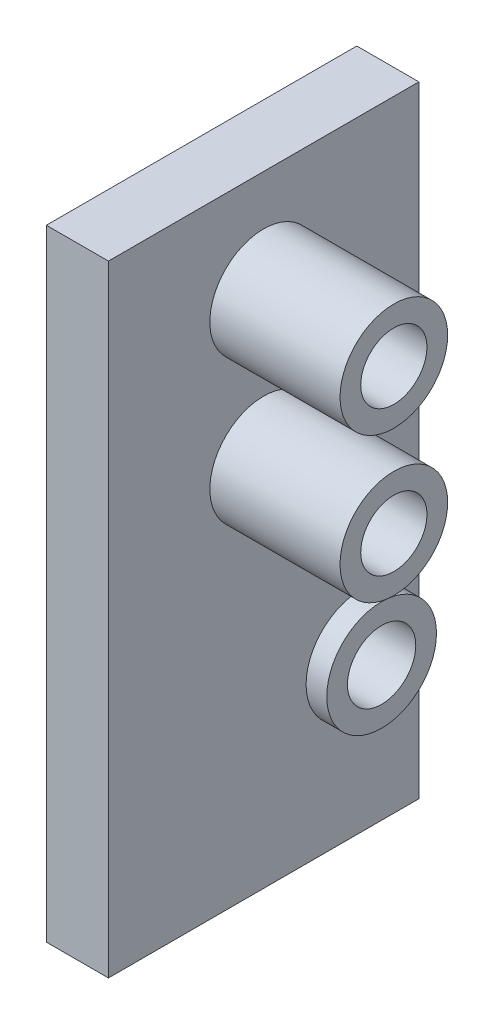
ISO-10303-21;
HEADER;
FILE_DESCRIPTION(('STEP AP214'),'2;1');
FILE_NAME('part.step','',(''),(''),'','','');
FILE_SCHEMA(('AUTOMOTIVE_DESIGN { 1 0 10303 214 1 1 1 1 }'));
ENDSEC;
DATA;
#1=APPLICATION_CONTEXT('core data for automotive mechanical design processes');
#2=APPLICATION_PROTOCOL_DEFINITION('international standard','automotive_design',2000,#1);
#3=PRODUCT_CONTEXT('',#1,'mechanical');
#4=PRODUCT('Part','Part','',(#3));
#5=PRODUCT_RELATED_PRODUCT_CATEGORY('part','',(#4));
#6=PRODUCT_DEFINITION_FORMATION('','',#4);
#7=PRODUCT_DEFINITION_CONTEXT('part definition',#1,'design');
#8=PRODUCT_DEFINITION('design','',#6,#7);
#9=PRODUCT_DEFINITION_SHAPE('','',#8);
#10=(LENGTH_UNIT() NAMED_UNIT(*) SI_UNIT(.MILLI.,.METRE.));
#11=(NAMED_UNIT(*) PLANE_ANGLE_UNIT() SI_UNIT($,.RADIAN.));
#12=(NAMED_UNIT(*) SI_UNIT($,.STERADIAN.) SOLID_ANGLE_UNIT());
#13=UNCERTAINTY_MEASURE_WITH_UNIT(LENGTH_MEASURE(1.E-05),#10,'distance_accuracy_value','');
#14=(GEOMETRIC_REPRESENTATION_CONTEXT(3) GLOBAL_UNCERTAINTY_ASSIGNED_CONTEXT((#13)) GLOBAL_UNIT_ASSIGNED_CONTEXT((#10,
#11,#12)) REPRESENTATION_CONTEXT('',''));
#15=CARTESIAN_POINT('',(0.,0.,0.));
#16=DIRECTION('',(0.,0.,1.));
#17=DIRECTION('',(1.,0.,0.));
#18=AXIS2_PLACEMENT_3D('',#15,#16,#17);
#19=CARTESIAN_POINT('',(-5.,0.,0.));
#20=DIRECTION('',(-1.,0.,0.));
#21=DIRECTION('',(0.,0.,1.));
#22=AXIS2_PLACEMENT_3D('',#19,#20,#21);
#23=PLANE('',#22);
#24=CARTESIAN_POINT('',(-5.,18.,7.5));
#25=DIRECTION('',(1.,0.,0.));
#26=DIRECTION('',(0.,0.,-1.));
#27=AXIS2_PLACEMENT_3D('',#24,#25,#26);
#28=CIRCLE('',#27,2.6);
#29=CARTESIAN_POINT('',(-5.,18.,4.9));
#30=VERTEX_POINT('',#29);
#31=EDGE_CURVE('E45',#30,#30,#28,.F.);
#32=ORIENTED_EDGE('',*,*,#31,.T.);
#33=EDGE_LOOP('',(#32));
#34=FACE_BOUND('',#33,.T.);
#35=DIRECTION('',(0.,0.,1.));
#36=VECTOR('',#35,1.);
#37=CARTESIAN_POINT('',(-5.,30.,0.));
#38=LINE('',#37,#36);
#39=CARTESIAN_POINT('',(-5.,30.,0.));
#40=VERTEX_POINT('',#39);
#41=CARTESIAN_POINT('',(-5.,30.,15.));
#42=VERTEX_POINT('',#41);
#43=EDGE_CURVE('E94',#40,#42,#38,.T.);
#44=ORIENTED_EDGE('',*,*,#43,.T.);
#45=DIRECTION('',(0.,1.,0.));
#46=VECTOR('',#45,1.);
#47=CARTESIAN_POINT('',(-5.,0.,15.));
#48=LINE('',#47,#46);
#49=CARTESIAN_POINT('',(-5.,0.,15.));
#50=VERTEX_POINT('',#49);
#51=EDGE_CURVE('E108',#50,#42,#48,.T.);
#52=ORIENTED_EDGE('',*,*,#51,.F.);
#53=DIRECTION('',(0.,0.,1.));
#54=VECTOR('',#53,1.);
#55=CARTESIAN_POINT('',(-5.,0.,0.));
#56=LINE('',#55,#54);
#57=CARTESIAN_POINT('',(-5.,0.,0.));
#58=VERTEX_POINT('',#57);
#59=EDGE_CURVE('E96',#58,#50,#56,.T.);
#60=ORIENTED_EDGE('',*,*,#59,.F.);
#61=DIRECTION('',(0.,1.,0.));
#62=VECTOR('',#61,1.);
#63=CARTESIAN_POINT('',(-5.,0.,0.));
#64=LINE('',#63,#62);
#65=EDGE_CURVE('E82',#58,#40,#64,.T.);
#66=ORIENTED_EDGE('',*,*,#65,.T.);
#67=EDGE_LOOP('',(#44,#52,#60,#66));
#68=FACE_BOUND('',#67,.T.);
#69=CARTESIAN_POINT('',(-5.,7.5,2.8));
#70=DIRECTION('',(-1.,0.,0.));
#71=DIRECTION('',(0.,0.,1.));
#72=AXIS2_PLACEMENT_3D('',#69,#70,#71);
#73=CIRCLE('',#72,2.65);
#74=CARTESIAN_POINT('',(-5.,7.5,5.45));
#75=VERTEX_POINT('',#74);
#76=EDGE_CURVE('E87',#75,#75,#73,.F.);
#77=ORIENTED_EDGE('',*,*,#76,.F.);
#78=EDGE_LOOP('',(#77));
#79=FACE_BOUND('',#78,.T.);
#80=CARTESIAN_POINT('',(-5.,25.,7.5));
#81=DIRECTION('',(1.,0.,0.));
#82=DIRECTION('',(0.,0.,-1.));
#83=AXIS2_PLACEMENT_3D('',#80,#81,#82);
#84=CIRCLE('',#83,2.6);
#85=CARTESIAN_POINT('',(-5.,25.,4.9));
#86=VERTEX_POINT('',#85);
#87=EDGE_CURVE('E11',#86,#86,#84,.F.);
#88=ORIENTED_EDGE('',*,*,#87,.T.);
#89=EDGE_LOOP('',(#88));
#90=FACE_BOUND('',#89,.T.);
#91=ADVANCED_FACE('F37',(#34,#68,#79,#90),#23,.F.);
#92=CARTESIAN_POINT('',(-6.,0.,0.));
#93=DIRECTION('',(0.,0.,1.));
#94=DIRECTION('',(1.,0.,0.));
#95=AXIS2_PLACEMENT_3D('',#92,#93,#94);
#96=PLANE('',#95);
#97=DIRECTION('',(0.,1.,0.));
#98=VECTOR('',#97,1.);
#99=CARTESIAN_POINT('',(-8.,0.,0.));
#100=LINE('',#99,#98);
#101=CARTESIAN_POINT('',(-8.,0.,0.));
#102=VERTEX_POINT('',#101);
#103=CARTESIAN_POINT('',(-8.,30.,0.));
#104=VERTEX_POINT('',#103);
#105=EDGE_CURVE('E84',#102,#104,#100,.T.);
#106=ORIENTED_EDGE('',*,*,#105,.T.);
#107=DIRECTION('',(-1.,0.,0.));
#108=VECTOR('',#107,1.);
#109=CARTESIAN_POINT('',(-6.,30.,0.));
#110=LINE('',#109,#108);
#111=EDGE_CURVE('E78',#40,#104,#110,.T.);
#112=ORIENTED_EDGE('',*,*,#111,.F.);
#113=ORIENTED_EDGE('',*,*,#65,.F.);
#114=DIRECTION('',(-1.,0.,0.));
#115=VECTOR('',#114,1.);
#116=CARTESIAN_POINT('',(-6.,0.,0.));
#117=LINE('',#116,#115);
#118=EDGE_CURVE('E123',#58,#102,#117,.T.);
#119=ORIENTED_EDGE('',*,*,#118,.T.);
#120=EDGE_LOOP('',(#106,#112,#113,#119));
#121=FACE_BOUND('',#120,.T.);
#122=ADVANCED_FACE('F80',(#121),#96,.F.);
#123=CARTESIAN_POINT('',(-6.,30.,0.));
#124=DIRECTION('',(0.,-1.,0.));
#125=DIRECTION('',(0.,0.,1.));
#126=AXIS2_PLACEMENT_3D('',#123,#124,#125);
#127=PLANE('',#126);
#128=DIRECTION('',(0.,0.,1.));
#129=VECTOR('',#128,1.);
#130=CARTESIAN_POINT('',(-8.,30.,0.));
#131=LINE('',#130,#129);
#132=CARTESIAN_POINT('',(-8.,30.,15.));
#133=VERTEX_POINT('',#132);
#134=EDGE_CURVE('E52',#104,#133,#131,.T.);
#135=ORIENTED_EDGE('',*,*,#134,.T.);
#136=DIRECTION('',(-1.,0.,0.));
#137=VECTOR('',#136,1.);
#138=CARTESIAN_POINT('',(-6.,30.,15.));
#139=LINE('',#138,#137);
#140=EDGE_CURVE('E88',#42,#133,#139,.T.);
#141=ORIENTED_EDGE('',*,*,#140,.F.);
#142=ORIENTED_EDGE('',*,*,#43,.F.);
#143=ORIENTED_EDGE('',*,*,#111,.T.);
#144=EDGE_LOOP('',(#135,#141,#142,#143));
#145=FACE_BOUND('',#144,.T.);
#146=ADVANCED_FACE('F98',(#145),#127,.F.);
#147=CARTESIAN_POINT('',(-6.,0.,15.));
#148=DIRECTION('',(0.,0.,1.));
#149=DIRECTION('',(1.,0.,0.));
#150=AXIS2_PLACEMENT_3D('',#147,#148,#149);
#151=PLANE('',#150);
#152=DIRECTION('',(0.,1.,0.));
#153=VECTOR('',#152,1.);
#154=CARTESIAN_POINT('',(-8.,0.,15.));
#155=LINE('',#154,#153);
#156=CARTESIAN_POINT('',(-8.,0.,15.));
#157=VERTEX_POINT('',#156);
#158=EDGE_CURVE('E57',#157,#133,#155,.T.);
#159=ORIENTED_EDGE('',*,*,#158,.F.);
#160=DIRECTION('',(-1.,0.,0.));
#161=VECTOR('',#160,1.);
#162=CARTESIAN_POINT('',(-6.,0.,15.));
#163=LINE('',#162,#161);
#164=EDGE_CURVE('E126',#50,#157,#163,.T.);
#165=ORIENTED_EDGE('',*,*,#164,.F.);
#166=ORIENTED_EDGE('',*,*,#51,.T.);
#167=ORIENTED_EDGE('',*,*,#140,.T.);
#168=EDGE_LOOP('',(#159,#165,#166,#167));
#169=FACE_BOUND('',#168,.T.);
#170=ADVANCED_FACE('F173',(#169),#151,.T.);
#171=CARTESIAN_POINT('',(-6.,25.,7.5));
#172=DIRECTION('',(-1.,0.,0.));
#173=DIRECTION('',(0.,0.,1.));
#174=AXIS2_PLACEMENT_3D('',#171,#172,#173);
#175=CYLINDRICAL_SURFACE('',#174,1.6);
#176=CARTESIAN_POINT('',(-8.,25.,7.5));
#177=DIRECTION('',(-1.,0.,0.));
#178=DIRECTION('',(0.,0.,1.));
#179=AXIS2_PLACEMENT_3D('',#176,#177,#178);
#180=CIRCLE('',#179,1.6);
#181=CARTESIAN_POINT('',(-8.,25.,9.1));
#182=VERTEX_POINT('',#181);
#183=EDGE_CURVE('E118',#182,#182,#180,.T.);
#184=ORIENTED_EDGE('',*,*,#183,.T.);
#185=EDGE_LOOP('',(#184));
#186=FACE_BOUND('',#185,.T.);
#187=CARTESIAN_POINT('',(1.29,25.,7.5));
#188=DIRECTION('',(-1.,0.,0.));
#189=DIRECTION('',(0.,0.,1.));
#190=AXIS2_PLACEMENT_3D('',#187,#188,#189);
#191=CIRCLE('',#190,1.6);
#192=CARTESIAN_POINT('',(1.29,25.,9.1));
#193=VERTEX_POINT('',#192);
#194=EDGE_CURVE('E200',#193,#193,#191,.T.);
#195=ORIENTED_EDGE('',*,*,#194,.F.);
#196=EDGE_LOOP('',(#195));
#197=FACE_BOUND('',#196,.T.);
#198=ADVANCED_FACE('F169',(#186,#197),#175,.F.);
#199=CARTESIAN_POINT('',(-6.,0.,0.));
#200=DIRECTION('',(0.,-1.,0.));
#201=DIRECTION('',(0.,0.,1.));
#202=AXIS2_PLACEMENT_3D('',#199,#200,#201);
#203=PLANE('',#202);
#204=DIRECTION('',(0.,0.,1.));
#205=VECTOR('',#204,1.);
#206=CARTESIAN_POINT('',(-8.,0.,0.));
#207=LINE('',#206,#205);
#208=EDGE_CURVE('E114',#102,#157,#207,.T.);
#209=ORIENTED_EDGE('',*,*,#208,.F.);
#210=ORIENTED_EDGE('',*,*,#118,.F.);
#211=ORIENTED_EDGE('',*,*,#59,.T.);
#212=ORIENTED_EDGE('',*,*,#164,.T.);
#213=EDGE_LOOP('',(#209,#210,#211,#212));
#214=FACE_BOUND('',#213,.T.);
#215=ADVANCED_FACE('F172',(#214),#203,.T.);
#216=CARTESIAN_POINT('',(-6.,7.5,2.8));
#217=DIRECTION('',(-1.,0.,0.));
#218=DIRECTION('',(0.,0.,1.));
#219=AXIS2_PLACEMENT_3D('',#216,#217,#218);
#220=CYLINDRICAL_SURFACE('',#219,1.65);
#221=CARTESIAN_POINT('',(-8.,7.5,2.8));
#222=DIRECTION('',(-1.,0.,0.));
#223=DIRECTION('',(0.,0.,1.));
#224=AXIS2_PLACEMENT_3D('',#221,#222,#223);
#225=CIRCLE('',#224,1.65);
#226=CARTESIAN_POINT('',(-8.,7.5,4.45));
#227=VERTEX_POINT('',#226);
#228=EDGE_CURVE('E110',#227,#227,#225,.T.);
#229=ORIENTED_EDGE('',*,*,#228,.T.);
#230=EDGE_LOOP('',(#229));
#231=FACE_BOUND('',#230,.T.);
#232=CARTESIAN_POINT('',(-4.,7.5,2.8));
#233=DIRECTION('',(1.,0.,0.));
#234=DIRECTION('',(0.,0.,-1.));
#235=AXIS2_PLACEMENT_3D('',#232,#233,#234);
#236=CIRCLE('',#235,1.65);
#237=CARTESIAN_POINT('',(-4.,7.5,1.15));
#238=VERTEX_POINT('',#237);
#239=EDGE_CURVE('E103',#238,#238,#236,.T.);
#240=ORIENTED_EDGE('',*,*,#239,.T.);
#241=EDGE_LOOP('',(#240));
#242=FACE_BOUND('',#241,.T.);
#243=ADVANCED_FACE('F39',(#231,#242),#220,.F.);
#244=CARTESIAN_POINT('',(-6.,18.,7.5));
#245=DIRECTION('',(-1.,0.,0.));
#246=DIRECTION('',(0.,0.,1.));
#247=AXIS2_PLACEMENT_3D('',#244,#245,#246);
#248=CYLINDRICAL_SURFACE('',#247,1.6);
#249=CARTESIAN_POINT('',(-8.,18.,7.5));
#250=DIRECTION('',(-1.,0.,0.));
#251=DIRECTION('',(0.,0.,1.));
#252=AXIS2_PLACEMENT_3D('',#249,#250,#251);
#253=CIRCLE('',#252,1.6);
#254=CARTESIAN_POINT('',(-8.,18.,9.1));
#255=VERTEX_POINT('',#254);
#256=EDGE_CURVE('E121',#255,#255,#253,.T.);
#257=ORIENTED_EDGE('',*,*,#256,.T.);
#258=EDGE_LOOP('',(#257));
#259=FACE_BOUND('',#258,.T.);
#260=CARTESIAN_POINT('',(1.29,18.,7.5));
#261=DIRECTION('',(-1.,0.,0.));
#262=DIRECTION('',(0.,0.,1.));
#263=AXIS2_PLACEMENT_3D('',#260,#261,#262);
#264=CIRCLE('',#263,1.6);
#265=CARTESIAN_POINT('',(1.29,18.,9.1));
#266=VERTEX_POINT('',#265);
#267=EDGE_CURVE('E193',#266,#266,#264,.T.);
#268=ORIENTED_EDGE('',*,*,#267,.F.);
#269=EDGE_LOOP('',(#268));
#270=FACE_BOUND('',#269,.T.);
#271=ADVANCED_FACE('F164',(#259,#270),#248,.F.);
#272=CARTESIAN_POINT('',(-8.,0.,0.));
#273=DIRECTION('',(-1.,0.,0.));
#274=DIRECTION('',(0.,0.,1.));
#275=AXIS2_PLACEMENT_3D('',#272,#273,#274);
#276=PLANE('',#275);
#277=ORIENTED_EDGE('',*,*,#228,.F.);
#278=EDGE_LOOP('',(#277));
#279=FACE_BOUND('',#278,.T.);
#280=ORIENTED_EDGE('',*,*,#105,.F.);
#281=ORIENTED_EDGE('',*,*,#208,.T.);
#282=ORIENTED_EDGE('',*,*,#158,.T.);
#283=ORIENTED_EDGE('',*,*,#134,.F.);
#284=EDGE_LOOP('',(#280,#281,#282,#283));
#285=FACE_BOUND('',#284,.T.);
#286=ORIENTED_EDGE('',*,*,#183,.F.);
#287=EDGE_LOOP('',(#286));
#288=FACE_BOUND('',#287,.T.);
#289=ORIENTED_EDGE('',*,*,#256,.F.);
#290=EDGE_LOOP('',(#289));
#291=FACE_BOUND('',#290,.T.);
#292=ADVANCED_FACE('F160',(#279,#285,#288,#291),#276,.T.);
#293=CARTESIAN_POINT('',(-4.,7.5,2.8));
#294=DIRECTION('',(1.,0.,0.));
#295=DIRECTION('',(0.,0.,-1.));
#296=AXIS2_PLACEMENT_3D('',#293,#294,#295);
#297=PLANE('',#296);
#298=CARTESIAN_POINT('',(-4.,7.5,2.8));
#299=DIRECTION('',(1.,0.,0.));
#300=DIRECTION('',(0.,0.,-1.));
#301=AXIS2_PLACEMENT_3D('',#298,#299,#300);
#302=CIRCLE('',#301,2.65);
#303=CARTESIAN_POINT('',(-4.,7.5,0.15));
#304=VERTEX_POINT('',#303);
#305=EDGE_CURVE('E100',#304,#304,#302,.T.);
#306=ORIENTED_EDGE('',*,*,#305,.T.);
#307=EDGE_LOOP('',(#306));
#308=FACE_BOUND('',#307,.T.);
#309=ORIENTED_EDGE('',*,*,#239,.F.);
#310=EDGE_LOOP('',(#309));
#311=FACE_BOUND('',#310,.T.);
#312=ADVANCED_FACE('F163',(#308,#311),#297,.T.);
#313=CARTESIAN_POINT('',(-4.,7.5,2.8));
#314=DIRECTION('',(-1.,0.,0.));
#315=DIRECTION('',(0.,0.,1.));
#316=AXIS2_PLACEMENT_3D('',#313,#314,#315);
#317=CYLINDRICAL_SURFACE('',#316,2.65);
#318=ORIENTED_EDGE('',*,*,#305,.F.);
#319=EDGE_LOOP('',(#318));
#320=FACE_BOUND('',#319,.T.);
#321=ORIENTED_EDGE('',*,*,#76,.T.);
#322=EDGE_LOOP('',(#321));
#323=FACE_BOUND('',#322,.T.);
#324=ADVANCED_FACE('F148',(#320,#323),#317,.T.);
#325=CARTESIAN_POINT('',(1.29,18.,7.5));
#326=DIRECTION('',(1.,0.,0.));
#327=DIRECTION('',(0.,0.,1.));
#328=AXIS2_PLACEMENT_3D('',#325,#326,#327);
#329=PLANE('',#328);
#330=CARTESIAN_POINT('',(1.29,18.,7.5));
#331=DIRECTION('',(-1.,0.,0.));
#332=DIRECTION('',(0.,0.,1.));
#333=AXIS2_PLACEMENT_3D('',#330,#331,#332);
#334=CIRCLE('',#333,2.6);
#335=CARTESIAN_POINT('',(1.29,18.,10.1));
#336=VERTEX_POINT('',#335);
#337=EDGE_CURVE('E195',#336,#336,#334,.T.);
#338=ORIENTED_EDGE('',*,*,#337,.F.);
#339=EDGE_LOOP('',(#338));
#340=FACE_BOUND('',#339,.T.);
#341=ORIENTED_EDGE('',*,*,#267,.T.);
#342=EDGE_LOOP('',(#341));
#343=FACE_BOUND('',#342,.T.);
#344=ADVANCED_FACE('F138',(#340,#343),#329,.T.);
#345=CARTESIAN_POINT('',(1.29,18.,7.5));
#346=DIRECTION('',(-1.,0.,0.));
#347=DIRECTION('',(0.,0.,-1.));
#348=AXIS2_PLACEMENT_3D('',#345,#346,#347);
#349=CYLINDRICAL_SURFACE('',#348,2.6);
#350=ORIENTED_EDGE('',*,*,#337,.T.);
#351=EDGE_LOOP('',(#350));
#352=FACE_BOUND('',#351,.T.);
#353=ORIENTED_EDGE('',*,*,#31,.F.);
#354=EDGE_LOOP('',(#353));
#355=FACE_BOUND('',#354,.T.);
#356=ADVANCED_FACE('F135',(#352,#355),#349,.T.);
#357=CARTESIAN_POINT('',(1.29,25.,7.5));
#358=DIRECTION('',(1.,0.,0.));
#359=DIRECTION('',(0.,0.,1.));
#360=AXIS2_PLACEMENT_3D('',#357,#358,#359);
#361=PLANE('',#360);
#362=CARTESIAN_POINT('',(1.29,25.,7.5));
#363=DIRECTION('',(-1.,0.,0.));
#364=DIRECTION('',(0.,0.,1.));
#365=AXIS2_PLACEMENT_3D('',#362,#363,#364);
#366=CIRCLE('',#365,2.6);
#367=CARTESIAN_POINT('',(1.29,25.,10.1));
#368=VERTEX_POINT('',#367);
#369=EDGE_CURVE('E196',#368,#368,#366,.T.);
#370=ORIENTED_EDGE('',*,*,#369,.F.);
#371=EDGE_LOOP('',(#370));
#372=FACE_BOUND('',#371,.T.);
#373=ORIENTED_EDGE('',*,*,#194,.T.);
#374=EDGE_LOOP('',(#373));
#375=FACE_BOUND('',#374,.T.);
#376=ADVANCED_FACE('F137',(#372,#375),#361,.T.);
#377=CARTESIAN_POINT('',(1.29,25.,7.5));
#378=DIRECTION('',(-1.,0.,0.));
#379=DIRECTION('',(0.,0.,-1.));
#380=AXIS2_PLACEMENT_3D('',#377,#378,#379);
#381=CYLINDRICAL_SURFACE('',#380,2.6);
#382=ORIENTED_EDGE('',*,*,#369,.T.);
#383=EDGE_LOOP('',(#382));
#384=FACE_BOUND('',#383,.T.);
#385=ORIENTED_EDGE('',*,*,#87,.F.);
#386=EDGE_LOOP('',(#385));
#387=FACE_BOUND('',#386,.T.);
#388=ADVANCED_FACE('F145',(#384,#387),#381,.T.);
#389=CLOSED_SHELL('',(#91,#122,#146,#170,#198,#215,#243,#271,#292,#312,#324,#344,#356,#376,#388));
#390=MANIFOLD_SOLID_BREP('B2',#389);
#391=ADVANCED_BREP_SHAPE_REPRESENTATION('',(#18,#390),#14);
#392=SHAPE_DEFINITION_REPRESENTATION(#9,#391);
ENDSEC;
END-ISO-10303-21;
